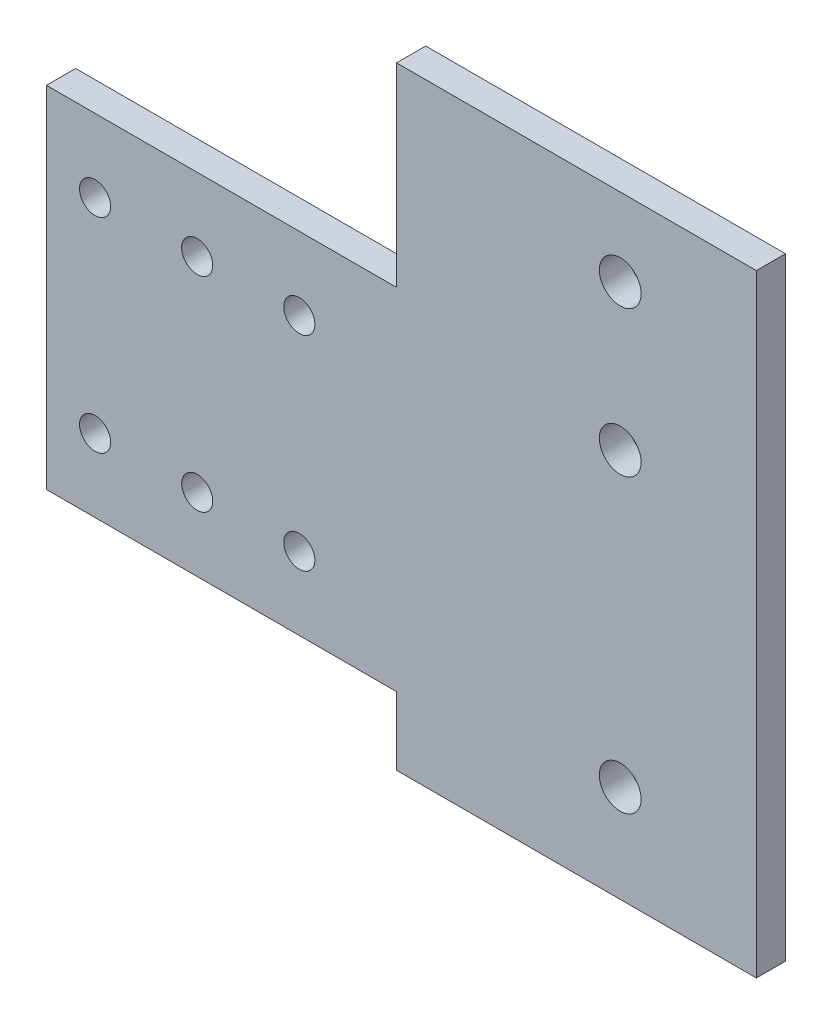
ISO-10303-21;
HEADER;
FILE_DESCRIPTION(('STEP AP214'),'2;1');
FILE_NAME('part.step','',(''),(''),'','','');
FILE_SCHEMA(('AUTOMOTIVE_DESIGN { 1 0 10303 214 1 1 1 1 }'));
ENDSEC;
DATA;
#1=APPLICATION_CONTEXT('core data for automotive mechanical design processes');
#2=APPLICATION_PROTOCOL_DEFINITION('international standard','automotive_design',2000,#1);
#3=PRODUCT_CONTEXT('',#1,'mechanical');
#4=PRODUCT('Part','Part','',(#3));
#5=PRODUCT_RELATED_PRODUCT_CATEGORY('part','',(#4));
#6=PRODUCT_DEFINITION_FORMATION('','',#4);
#7=PRODUCT_DEFINITION_CONTEXT('part definition',#1,'design');
#8=PRODUCT_DEFINITION('design','',#6,#7);
#9=PRODUCT_DEFINITION_SHAPE('','',#8);
#10=(LENGTH_UNIT() NAMED_UNIT(*) SI_UNIT(.MILLI.,.METRE.));
#11=(NAMED_UNIT(*) PLANE_ANGLE_UNIT() SI_UNIT($,.RADIAN.));
#12=(NAMED_UNIT(*) SI_UNIT($,.STERADIAN.) SOLID_ANGLE_UNIT());
#13=UNCERTAINTY_MEASURE_WITH_UNIT(LENGTH_MEASURE(1.E-05),#10,'distance_accuracy_value','');
#14=(GEOMETRIC_REPRESENTATION_CONTEXT(3) GLOBAL_UNCERTAINTY_ASSIGNED_CONTEXT((#13)) GLOBAL_UNIT_ASSIGNED_CONTEXT((#10,
#11,#12)) REPRESENTATION_CONTEXT('',''));
#15=CARTESIAN_POINT('',(0.,0.,0.));
#16=DIRECTION('',(0.,0.,1.));
#17=DIRECTION('',(1.,0.,0.));
#18=AXIS2_PLACEMENT_3D('',#15,#16,#17);
#19=CARTESIAN_POINT('',(0.,-36.,3.));
#20=DIRECTION('',(1.,0.,0.));
#21=DIRECTION('',(0.,0.,-1.));
#22=AXIS2_PLACEMENT_3D('',#19,#20,#21);
#23=PLANE('',#22);
#24=DIRECTION('',(0.,-1.,0.));
#25=VECTOR('',#24,1.);
#26=CARTESIAN_POINT('',(0.,-36.,0.));
#27=LINE('',#26,#25);
#28=CARTESIAN_POINT('',(0.,0.,0.));
#29=VERTEX_POINT('',#28);
#30=CARTESIAN_POINT('',(0.,-36.,0.));
#31=VERTEX_POINT('',#30);
#32=EDGE_CURVE('E131',#29,#31,#27,.T.);
#33=ORIENTED_EDGE('',*,*,#32,.T.);
#34=DIRECTION('',(0.,0.,-1.));
#35=VECTOR('',#34,1.);
#36=CARTESIAN_POINT('',(0.,-36.,3.));
#37=LINE('',#36,#35);
#38=CARTESIAN_POINT('',(0.,-36.,3.));
#39=VERTEX_POINT('',#38);
#40=EDGE_CURVE('E11',#39,#31,#37,.T.);
#41=ORIENTED_EDGE('',*,*,#40,.F.);
#42=DIRECTION('',(0.,-1.,0.));
#43=VECTOR('',#42,1.);
#44=CARTESIAN_POINT('',(0.,-36.,3.));
#45=LINE('',#44,#43);
#46=CARTESIAN_POINT('',(0.,0.,3.));
#47=VERTEX_POINT('',#46);
#48=EDGE_CURVE('E146',#47,#39,#45,.T.);
#49=ORIENTED_EDGE('',*,*,#48,.F.);
#50=DIRECTION('',(0.,0.,-1.));
#51=VECTOR('',#50,1.);
#52=CARTESIAN_POINT('',(0.,0.,3.));
#53=LINE('',#52,#51);
#54=EDGE_CURVE('E127',#47,#29,#53,.T.);
#55=ORIENTED_EDGE('',*,*,#54,.T.);
#56=EDGE_LOOP('',(#33,#41,#49,#55));
#57=FACE_BOUND('',#56,.T.);
#58=ADVANCED_FACE('F33',(#57),#23,.F.);
#59=CARTESIAN_POINT('',(36.,-36.,3.));
#60=DIRECTION('',(0.,1.,0.));
#61=DIRECTION('',(-1.,0.,0.));
#62=AXIS2_PLACEMENT_3D('',#59,#60,#61);
#63=PLANE('',#62);
#64=DIRECTION('',(1.,0.,0.));
#65=VECTOR('',#64,1.);
#66=CARTESIAN_POINT('',(36.,-36.,0.));
#67=LINE('',#66,#65);
#68=CARTESIAN_POINT('',(36.,-36.,0.));
#69=VERTEX_POINT('',#68);
#70=EDGE_CURVE('E134',#31,#69,#67,.T.);
#71=ORIENTED_EDGE('',*,*,#70,.T.);
#72=DIRECTION('',(0.,0.,-1.));
#73=VECTOR('',#72,1.);
#74=CARTESIAN_POINT('',(36.,-36.,3.));
#75=LINE('',#74,#73);
#76=CARTESIAN_POINT('',(36.,-36.,3.));
#77=VERTEX_POINT('',#76);
#78=EDGE_CURVE('E40',#77,#69,#75,.T.);
#79=ORIENTED_EDGE('',*,*,#78,.F.);
#80=DIRECTION('',(1.,0.,0.));
#81=VECTOR('',#80,1.);
#82=CARTESIAN_POINT('',(36.,-36.,3.));
#83=LINE('',#82,#81);
#84=EDGE_CURVE('E91',#39,#77,#83,.T.);
#85=ORIENTED_EDGE('',*,*,#84,.F.);
#86=ORIENTED_EDGE('',*,*,#40,.T.);
#87=EDGE_LOOP('',(#71,#79,#85,#86));
#88=FACE_BOUND('',#87,.T.);
#89=ADVANCED_FACE('F234',(#88),#63,.F.);
#90=CARTESIAN_POINT('',(36.,-56.,3.));
#91=DIRECTION('',(1.,0.,0.));
#92=DIRECTION('',(0.,1.,0.));
#93=AXIS2_PLACEMENT_3D('',#90,#91,#92);
#94=PLANE('',#93);
#95=DIRECTION('',(0.,-1.,0.));
#96=VECTOR('',#95,1.);
#97=CARTESIAN_POINT('',(36.,-56.,0.));
#98=LINE('',#97,#96);
#99=CARTESIAN_POINT('',(36.,-43.,0.));
#100=VERTEX_POINT('',#99);
#101=EDGE_CURVE('E137',#69,#100,#98,.T.);
#102=ORIENTED_EDGE('',*,*,#101,.T.);
#103=DIRECTION('',(0.,0.,1.));
#104=VECTOR('',#103,1.);
#105=CARTESIAN_POINT('',(36.,-43.,0.));
#106=LINE('',#105,#104);
#107=CARTESIAN_POINT('',(36.,-43.,3.));
#108=VERTEX_POINT('',#107);
#109=EDGE_CURVE('E47',#100,#108,#106,.T.);
#110=ORIENTED_EDGE('',*,*,#109,.T.);
#111=DIRECTION('',(0.,-1.,0.));
#112=VECTOR('',#111,1.);
#113=CARTESIAN_POINT('',(36.,-56.,3.));
#114=LINE('',#113,#112);
#115=EDGE_CURVE('E154',#77,#108,#114,.T.);
#116=ORIENTED_EDGE('',*,*,#115,.F.);
#117=ORIENTED_EDGE('',*,*,#78,.T.);
#118=EDGE_LOOP('',(#102,#110,#116,#117));
#119=FACE_BOUND('',#118,.T.);
#120=ADVANCED_FACE('F153',(#119),#94,.F.);
#121=CARTESIAN_POINT('',(73.,20.,3.));
#122=DIRECTION('',(-1.,0.,0.));
#123=DIRECTION('',(0.,0.,1.));
#124=AXIS2_PLACEMENT_3D('',#121,#122,#123);
#125=PLANE('',#124);
#126=DIRECTION('',(0.,1.,0.));
#127=VECTOR('',#126,1.);
#128=CARTESIAN_POINT('',(73.,20.,3.));
#129=LINE('',#128,#127);
#130=CARTESIAN_POINT('',(73.,-43.,3.));
#131=VERTEX_POINT('',#130);
#132=CARTESIAN_POINT('',(73.,20.,3.));
#133=VERTEX_POINT('',#132);
#134=EDGE_CURVE('E110',#131,#133,#129,.T.);
#135=ORIENTED_EDGE('',*,*,#134,.F.);
#136=DIRECTION('',(0.,0.,1.));
#137=VECTOR('',#136,1.);
#138=CARTESIAN_POINT('',(73.,-43.,0.));
#139=LINE('',#138,#137);
#140=CARTESIAN_POINT('',(73.,-43.,0.));
#141=VERTEX_POINT('',#140);
#142=EDGE_CURVE('E163',#141,#131,#139,.T.);
#143=ORIENTED_EDGE('',*,*,#142,.F.);
#144=DIRECTION('',(0.,1.,0.));
#145=VECTOR('',#144,1.);
#146=CARTESIAN_POINT('',(73.,20.,0.));
#147=LINE('',#146,#145);
#148=CARTESIAN_POINT('',(73.,20.,0.));
#149=VERTEX_POINT('',#148);
#150=EDGE_CURVE('E140',#141,#149,#147,.T.);
#151=ORIENTED_EDGE('',*,*,#150,.T.);
#152=DIRECTION('',(0.,0.,-1.));
#153=VECTOR('',#152,1.);
#154=CARTESIAN_POINT('',(73.,20.,3.));
#155=LINE('',#154,#153);
#156=EDGE_CURVE('E122',#133,#149,#155,.T.);
#157=ORIENTED_EDGE('',*,*,#156,.F.);
#158=EDGE_LOOP('',(#135,#143,#151,#157));
#159=FACE_BOUND('',#158,.T.);
#160=ADVANCED_FACE('F229',(#159),#125,.F.);
#161=CARTESIAN_POINT('',(36.,20.,3.));
#162=DIRECTION('',(0.,-1.,0.));
#163=DIRECTION('',(0.,0.,-1.));
#164=AXIS2_PLACEMENT_3D('',#161,#162,#163);
#165=PLANE('',#164);
#166=DIRECTION('',(-1.,0.,0.));
#167=VECTOR('',#166,1.);
#168=CARTESIAN_POINT('',(36.,20.,0.));
#169=LINE('',#168,#167);
#170=CARTESIAN_POINT('',(36.,20.,0.));
#171=VERTEX_POINT('',#170);
#172=EDGE_CURVE('E119',#149,#171,#169,.T.);
#173=ORIENTED_EDGE('',*,*,#172,.T.);
#174=DIRECTION('',(0.,0.,-1.));
#175=VECTOR('',#174,1.);
#176=CARTESIAN_POINT('',(36.,20.,3.));
#177=LINE('',#176,#175);
#178=CARTESIAN_POINT('',(36.,20.,3.));
#179=VERTEX_POINT('',#178);
#180=EDGE_CURVE('E116',#179,#171,#177,.T.);
#181=ORIENTED_EDGE('',*,*,#180,.F.);
#182=DIRECTION('',(-1.,0.,0.));
#183=VECTOR('',#182,1.);
#184=CARTESIAN_POINT('',(36.,20.,3.));
#185=LINE('',#184,#183);
#186=EDGE_CURVE('E101',#133,#179,#185,.T.);
#187=ORIENTED_EDGE('',*,*,#186,.F.);
#188=ORIENTED_EDGE('',*,*,#156,.T.);
#189=EDGE_LOOP('',(#173,#181,#187,#188));
#190=FACE_BOUND('',#189,.T.);
#191=ADVANCED_FACE('F117',(#190),#165,.F.);
#192=CARTESIAN_POINT('',(36.,0.,3.));
#193=DIRECTION('',(1.,0.,0.));
#194=DIRECTION('',(0.,0.,-1.));
#195=AXIS2_PLACEMENT_3D('',#192,#193,#194);
#196=PLANE('',#195);
#197=DIRECTION('',(0.,-1.,0.));
#198=VECTOR('',#197,1.);
#199=CARTESIAN_POINT('',(36.,0.,0.));
#200=LINE('',#199,#198);
#201=CARTESIAN_POINT('',(36.,0.,0.));
#202=VERTEX_POINT('',#201);
#203=EDGE_CURVE('E143',#171,#202,#200,.T.);
#204=ORIENTED_EDGE('',*,*,#203,.T.);
#205=DIRECTION('',(0.,0.,-1.));
#206=VECTOR('',#205,1.);
#207=CARTESIAN_POINT('',(36.,0.,3.));
#208=LINE('',#207,#206);
#209=CARTESIAN_POINT('',(36.,0.,3.));
#210=VERTEX_POINT('',#209);
#211=EDGE_CURVE('E123',#210,#202,#208,.T.);
#212=ORIENTED_EDGE('',*,*,#211,.F.);
#213=DIRECTION('',(0.,-1.,0.));
#214=VECTOR('',#213,1.);
#215=CARTESIAN_POINT('',(36.,0.,3.));
#216=LINE('',#215,#214);
#217=EDGE_CURVE('E106',#179,#210,#216,.T.);
#218=ORIENTED_EDGE('',*,*,#217,.F.);
#219=ORIENTED_EDGE('',*,*,#180,.T.);
#220=EDGE_LOOP('',(#204,#212,#218,#219));
#221=FACE_BOUND('',#220,.T.);
#222=ADVANCED_FACE('F125',(#221),#196,.F.);
#223=CARTESIAN_POINT('',(0.,0.,3.));
#224=DIRECTION('',(0.,-1.,0.));
#225=DIRECTION('',(0.,0.,-1.));
#226=AXIS2_PLACEMENT_3D('',#223,#224,#225);
#227=PLANE('',#226);
#228=DIRECTION('',(-1.,0.,0.));
#229=VECTOR('',#228,1.);
#230=CARTESIAN_POINT('',(0.,0.,0.));
#231=LINE('',#230,#229);
#232=EDGE_CURVE('E83',#202,#29,#231,.T.);
#233=ORIENTED_EDGE('',*,*,#232,.T.);
#234=ORIENTED_EDGE('',*,*,#54,.F.);
#235=DIRECTION('',(-1.,0.,0.));
#236=VECTOR('',#235,1.);
#237=CARTESIAN_POINT('',(0.,0.,3.));
#238=LINE('',#237,#236);
#239=EDGE_CURVE('E56',#210,#47,#238,.T.);
#240=ORIENTED_EDGE('',*,*,#239,.F.);
#241=ORIENTED_EDGE('',*,*,#211,.T.);
#242=EDGE_LOOP('',(#233,#234,#240,#241));
#243=FACE_BOUND('',#242,.T.);
#244=ADVANCED_FACE('F230',(#243),#227,.F.);
#245=CARTESIAN_POINT('',(0.,0.,3.));
#246=DIRECTION('',(0.,0.,-1.));
#247=DIRECTION('',(-1.,0.,0.));
#248=AXIS2_PLACEMENT_3D('',#245,#246,#247);
#249=PLANE('',#248);
#250=CARTESIAN_POINT('',(58.9999999999934,11.9999999999997,3.));
#251=DIRECTION('',(0.,0.,-1.));
#252=DIRECTION('',(-1.,0.,0.));
#253=AXIS2_PLACEMENT_3D('',#250,#251,#252);
#254=CIRCLE('',#253,2.15);
#255=CARTESIAN_POINT('',(56.8499999999934,11.9999999999997,3.));
#256=VERTEX_POINT('',#255);
#257=EDGE_CURVE('E171',#256,#256,#254,.T.);
#258=ORIENTED_EDGE('',*,*,#257,.T.);
#259=EDGE_LOOP('',(#258));
#260=FACE_BOUND('',#259,.T.);
#261=CARTESIAN_POINT('',(58.9999999999934,-3.00000000000027,3.));
#262=DIRECTION('',(0.,0.,-1.));
#263=DIRECTION('',(-1.,0.,0.));
#264=AXIS2_PLACEMENT_3D('',#261,#262,#263);
#265=CIRCLE('',#264,2.15);
#266=CARTESIAN_POINT('',(56.8499999999934,-3.00000000000027,3.));
#267=VERTEX_POINT('',#266);
#268=EDGE_CURVE('E178',#267,#267,#265,.T.);
#269=ORIENTED_EDGE('',*,*,#268,.T.);
#270=EDGE_LOOP('',(#269));
#271=FACE_BOUND('',#270,.T.);
#272=CARTESIAN_POINT('',(58.9999999999999,-33.0000000000002,3.));
#273=DIRECTION('',(0.,0.,-1.));
#274=DIRECTION('',(-1.,0.,0.));
#275=AXIS2_PLACEMENT_3D('',#272,#273,#274);
#276=CIRCLE('',#275,2.15);
#277=CARTESIAN_POINT('',(56.8499999999999,-33.0000000000002,3.));
#278=VERTEX_POINT('',#277);
#279=EDGE_CURVE('E183',#278,#278,#276,.T.);
#280=ORIENTED_EDGE('',*,*,#279,.T.);
#281=EDGE_LOOP('',(#280));
#282=FACE_BOUND('',#281,.T.);
#283=CARTESIAN_POINT('',(15.5,-28.5,3.));
#284=DIRECTION('',(0.,0.,-1.));
#285=DIRECTION('',(-1.,0.,0.));
#286=AXIS2_PLACEMENT_3D('',#283,#284,#285);
#287=CIRCLE('',#286,1.6);
#288=CARTESIAN_POINT('',(13.9,-28.5,3.));
#289=VERTEX_POINT('',#288);
#290=EDGE_CURVE('E202',#289,#289,#287,.T.);
#291=ORIENTED_EDGE('',*,*,#290,.T.);
#292=EDGE_LOOP('',(#291));
#293=FACE_BOUND('',#292,.T.);
#294=CARTESIAN_POINT('',(5.,-28.5,3.));
#295=DIRECTION('',(0.,0.,-1.));
#296=DIRECTION('',(-1.,0.,0.));
#297=AXIS2_PLACEMENT_3D('',#294,#295,#296);
#298=CIRCLE('',#297,1.6);
#299=CARTESIAN_POINT('',(3.4,-28.5,3.));
#300=VERTEX_POINT('',#299);
#301=EDGE_CURVE('E195',#300,#300,#298,.T.);
#302=ORIENTED_EDGE('',*,*,#301,.T.);
#303=EDGE_LOOP('',(#302));
#304=FACE_BOUND('',#303,.T.);
#305=CARTESIAN_POINT('',(5.,-7.5,3.));
#306=DIRECTION('',(0.,0.,-1.));
#307=DIRECTION('',(-1.,0.,0.));
#308=AXIS2_PLACEMENT_3D('',#305,#306,#307);
#309=CIRCLE('',#308,1.6);
#310=CARTESIAN_POINT('',(3.4,-7.5,3.));
#311=VERTEX_POINT('',#310);
#312=EDGE_CURVE('E214',#311,#311,#309,.T.);
#313=ORIENTED_EDGE('',*,*,#312,.T.);
#314=EDGE_LOOP('',(#313));
#315=FACE_BOUND('',#314,.T.);
#316=CARTESIAN_POINT('',(26.,-28.5,3.));
#317=DIRECTION('',(0.,0.,-1.));
#318=DIRECTION('',(-1.,0.,0.));
#319=AXIS2_PLACEMENT_3D('',#316,#317,#318);
#320=CIRCLE('',#319,1.6);
#321=CARTESIAN_POINT('',(24.4,-28.5,3.));
#322=VERTEX_POINT('',#321);
#323=EDGE_CURVE('E207',#322,#322,#320,.T.);
#324=ORIENTED_EDGE('',*,*,#323,.T.);
#325=EDGE_LOOP('',(#324));
#326=FACE_BOUND('',#325,.T.);
#327=CARTESIAN_POINT('',(15.5,-7.5,3.));
#328=DIRECTION('',(0.,0.,-1.));
#329=DIRECTION('',(-1.,0.,0.));
#330=AXIS2_PLACEMENT_3D('',#327,#328,#329);
#331=CIRCLE('',#330,1.6);
#332=CARTESIAN_POINT('',(13.9,-7.5,3.));
#333=VERTEX_POINT('',#332);
#334=EDGE_CURVE('E189',#333,#333,#331,.T.);
#335=ORIENTED_EDGE('',*,*,#334,.T.);
#336=EDGE_LOOP('',(#335));
#337=FACE_BOUND('',#336,.T.);
#338=CARTESIAN_POINT('',(26.,-7.5,3.));
#339=DIRECTION('',(0.,0.,-1.));
#340=DIRECTION('',(-1.,0.,0.));
#341=AXIS2_PLACEMENT_3D('',#338,#339,#340);
#342=CIRCLE('',#341,1.6);
#343=CARTESIAN_POINT('',(24.4,-7.5,3.));
#344=VERTEX_POINT('',#343);
#345=EDGE_CURVE('E135',#344,#344,#342,.T.);
#346=ORIENTED_EDGE('',*,*,#345,.T.);
#347=EDGE_LOOP('',(#346));
#348=FACE_BOUND('',#347,.T.);
#349=ORIENTED_EDGE('',*,*,#115,.T.);
#350=DIRECTION('',(-1.,0.,0.));
#351=VECTOR('',#350,1.);
#352=CARTESIAN_POINT('',(36.,-43.,3.));
#353=LINE('',#352,#351);
#354=EDGE_CURVE('E164',#131,#108,#353,.T.);
#355=ORIENTED_EDGE('',*,*,#354,.F.);
#356=ORIENTED_EDGE('',*,*,#134,.T.);
#357=ORIENTED_EDGE('',*,*,#186,.T.);
#358=ORIENTED_EDGE('',*,*,#217,.T.);
#359=ORIENTED_EDGE('',*,*,#239,.T.);
#360=ORIENTED_EDGE('',*,*,#48,.T.);
#361=ORIENTED_EDGE('',*,*,#84,.T.);
#362=EDGE_LOOP('',(#349,#355,#356,#357,#358,#359,#360,#361));
#363=FACE_BOUND('',#362,.T.);
#364=ADVANCED_FACE('F104',(#260,#271,#282,#293,#304,#315,#326,#337,#348,#363),#249,.F.);
#365=CARTESIAN_POINT('',(0.,0.,0.));
#366=DIRECTION('',(0.,0.,-1.));
#367=DIRECTION('',(-1.,0.,0.));
#368=AXIS2_PLACEMENT_3D('',#365,#366,#367);
#369=PLANE('',#368);
#370=DIRECTION('',(-1.,0.,0.));
#371=VECTOR('',#370,1.);
#372=CARTESIAN_POINT('',(36.,-43.,0.));
#373=LINE('',#372,#371);
#374=EDGE_CURVE('E160',#141,#100,#373,.T.);
#375=ORIENTED_EDGE('',*,*,#374,.T.);
#376=ORIENTED_EDGE('',*,*,#101,.F.);
#377=ORIENTED_EDGE('',*,*,#70,.F.);
#378=ORIENTED_EDGE('',*,*,#32,.F.);
#379=ORIENTED_EDGE('',*,*,#232,.F.);
#380=ORIENTED_EDGE('',*,*,#203,.F.);
#381=ORIENTED_EDGE('',*,*,#172,.F.);
#382=ORIENTED_EDGE('',*,*,#150,.F.);
#383=EDGE_LOOP('',(#375,#376,#377,#378,#379,#380,#381,#382));
#384=FACE_BOUND('',#383,.T.);
#385=CARTESIAN_POINT('',(58.9999999999934,11.9999999999997,0.));
#386=DIRECTION('',(0.,0.,-1.));
#387=DIRECTION('',(-1.,0.,0.));
#388=AXIS2_PLACEMENT_3D('',#385,#386,#387);
#389=CIRCLE('',#388,2.15);
#390=CARTESIAN_POINT('',(56.8499999999934,11.9999999999997,0.));
#391=VERTEX_POINT('',#390);
#392=EDGE_CURVE('E175',#391,#391,#389,.T.);
#393=ORIENTED_EDGE('',*,*,#392,.F.);
#394=EDGE_LOOP('',(#393));
#395=FACE_BOUND('',#394,.T.);
#396=CARTESIAN_POINT('',(58.9999999999934,-3.00000000000027,0.));
#397=DIRECTION('',(0.,0.,-1.));
#398=DIRECTION('',(-1.,0.,0.));
#399=AXIS2_PLACEMENT_3D('',#396,#397,#398);
#400=CIRCLE('',#399,2.15);
#401=CARTESIAN_POINT('',(56.8499999999934,-3.00000000000027,0.));
#402=VERTEX_POINT('',#401);
#403=EDGE_CURVE('E169',#402,#402,#400,.T.);
#404=ORIENTED_EDGE('',*,*,#403,.F.);
#405=EDGE_LOOP('',(#404));
#406=FACE_BOUND('',#405,.T.);
#407=CARTESIAN_POINT('',(58.9999999999999,-33.0000000000002,0.));
#408=DIRECTION('',(0.,0.,-1.));
#409=DIRECTION('',(-1.,0.,0.));
#410=AXIS2_PLACEMENT_3D('',#407,#408,#409);
#411=CIRCLE('',#410,2.15);
#412=CARTESIAN_POINT('',(56.8499999999999,-33.0000000000002,0.));
#413=VERTEX_POINT('',#412);
#414=EDGE_CURVE('E174',#413,#413,#411,.T.);
#415=ORIENTED_EDGE('',*,*,#414,.F.);
#416=EDGE_LOOP('',(#415));
#417=FACE_BOUND('',#416,.T.);
#418=CARTESIAN_POINT('',(15.5,-28.5,0.));
#419=DIRECTION('',(0.,0.,-1.));
#420=DIRECTION('',(-1.,0.,0.));
#421=AXIS2_PLACEMENT_3D('',#418,#419,#420);
#422=CIRCLE('',#421,1.6);
#423=CARTESIAN_POINT('',(13.9,-28.5,0.));
#424=VERTEX_POINT('',#423);
#425=EDGE_CURVE('E192',#424,#424,#422,.T.);
#426=ORIENTED_EDGE('',*,*,#425,.F.);
#427=EDGE_LOOP('',(#426));
#428=FACE_BOUND('',#427,.T.);
#429=CARTESIAN_POINT('',(5.,-28.5,0.));
#430=DIRECTION('',(0.,0.,-1.));
#431=DIRECTION('',(-1.,0.,0.));
#432=AXIS2_PLACEMENT_3D('',#429,#430,#431);
#433=CIRCLE('',#432,1.6);
#434=CARTESIAN_POINT('',(3.4,-28.5,0.));
#435=VERTEX_POINT('',#434);
#436=EDGE_CURVE('E199',#435,#435,#433,.T.);
#437=ORIENTED_EDGE('',*,*,#436,.F.);
#438=EDGE_LOOP('',(#437));
#439=FACE_BOUND('',#438,.T.);
#440=CARTESIAN_POINT('',(5.,-7.5,0.));
#441=DIRECTION('',(0.,0.,-1.));
#442=DIRECTION('',(-1.,0.,0.));
#443=AXIS2_PLACEMENT_3D('',#440,#441,#442);
#444=CIRCLE('',#443,1.6);
#445=CARTESIAN_POINT('',(3.4,-7.5,0.));
#446=VERTEX_POINT('',#445);
#447=EDGE_CURVE('E198',#446,#446,#444,.T.);
#448=ORIENTED_EDGE('',*,*,#447,.F.);
#449=EDGE_LOOP('',(#448));
#450=FACE_BOUND('',#449,.T.);
#451=CARTESIAN_POINT('',(26.,-28.5,0.));
#452=DIRECTION('',(0.,0.,-1.));
#453=DIRECTION('',(-1.,0.,0.));
#454=AXIS2_PLACEMENT_3D('',#451,#452,#453);
#455=CIRCLE('',#454,1.6);
#456=CARTESIAN_POINT('',(24.4,-28.5,0.));
#457=VERTEX_POINT('',#456);
#458=EDGE_CURVE('E211',#457,#457,#455,.T.);
#459=ORIENTED_EDGE('',*,*,#458,.F.);
#460=EDGE_LOOP('',(#459));
#461=FACE_BOUND('',#460,.T.);
#462=CARTESIAN_POINT('',(15.5,-7.5,0.));
#463=DIRECTION('',(0.,0.,-1.));
#464=DIRECTION('',(-1.,0.,0.));
#465=AXIS2_PLACEMENT_3D('',#462,#463,#464);
#466=CIRCLE('',#465,1.6);
#467=CARTESIAN_POINT('',(13.9,-7.5,0.));
#468=VERTEX_POINT('',#467);
#469=EDGE_CURVE('E186',#468,#468,#466,.T.);
#470=ORIENTED_EDGE('',*,*,#469,.F.);
#471=EDGE_LOOP('',(#470));
#472=FACE_BOUND('',#471,.T.);
#473=CARTESIAN_POINT('',(26.,-7.5,0.));
#474=DIRECTION('',(0.,0.,-1.));
#475=DIRECTION('',(-1.,0.,0.));
#476=AXIS2_PLACEMENT_3D('',#473,#474,#475);
#477=CIRCLE('',#476,1.6);
#478=CARTESIAN_POINT('',(24.4,-7.5,0.));
#479=VERTEX_POINT('',#478);
#480=EDGE_CURVE('E210',#479,#479,#477,.T.);
#481=ORIENTED_EDGE('',*,*,#480,.F.);
#482=EDGE_LOOP('',(#481));
#483=FACE_BOUND('',#482,.T.);
#484=ADVANCED_FACE('F156',(#384,#395,#406,#417,#428,#439,#450,#461,#472,#483),#369,.T.);
#485=CARTESIAN_POINT('',(26.,-7.5,3.));
#486=DIRECTION('',(0.,0.,-1.));
#487=DIRECTION('',(-1.,0.,0.));
#488=AXIS2_PLACEMENT_3D('',#485,#486,#487);
#489=CYLINDRICAL_SURFACE('',#488,1.6);
#490=ORIENTED_EDGE('',*,*,#345,.F.);
#491=EDGE_LOOP('',(#490));
#492=FACE_BOUND('',#491,.T.);
#493=ORIENTED_EDGE('',*,*,#480,.T.);
#494=EDGE_LOOP('',(#493));
#495=FACE_BOUND('',#494,.T.);
#496=ADVANCED_FACE('F252',(#492,#495),#489,.F.);
#497=CARTESIAN_POINT('',(15.5,-7.5,3.));
#498=DIRECTION('',(0.,0.,-1.));
#499=DIRECTION('',(-1.,0.,0.));
#500=AXIS2_PLACEMENT_3D('',#497,#498,#499);
#501=CYLINDRICAL_SURFACE('',#500,1.6);
#502=ORIENTED_EDGE('',*,*,#334,.F.);
#503=EDGE_LOOP('',(#502));
#504=FACE_BOUND('',#503,.T.);
#505=ORIENTED_EDGE('',*,*,#469,.T.);
#506=EDGE_LOOP('',(#505));
#507=FACE_BOUND('',#506,.T.);
#508=ADVANCED_FACE('F258',(#504,#507),#501,.F.);
#509=CARTESIAN_POINT('',(26.,-28.5,3.));
#510=DIRECTION('',(0.,0.,-1.));
#511=DIRECTION('',(-1.,0.,0.));
#512=AXIS2_PLACEMENT_3D('',#509,#510,#511);
#513=CYLINDRICAL_SURFACE('',#512,1.6);
#514=ORIENTED_EDGE('',*,*,#323,.F.);
#515=EDGE_LOOP('',(#514));
#516=FACE_BOUND('',#515,.T.);
#517=ORIENTED_EDGE('',*,*,#458,.T.);
#518=EDGE_LOOP('',(#517));
#519=FACE_BOUND('',#518,.T.);
#520=ADVANCED_FACE('F264',(#516,#519),#513,.F.);
#521=CARTESIAN_POINT('',(5.,-7.5,3.));
#522=DIRECTION('',(0.,0.,-1.));
#523=DIRECTION('',(-1.,0.,0.));
#524=AXIS2_PLACEMENT_3D('',#521,#522,#523);
#525=CYLINDRICAL_SURFACE('',#524,1.6);
#526=ORIENTED_EDGE('',*,*,#312,.F.);
#527=EDGE_LOOP('',(#526));
#528=FACE_BOUND('',#527,.T.);
#529=ORIENTED_EDGE('',*,*,#447,.T.);
#530=EDGE_LOOP('',(#529));
#531=FACE_BOUND('',#530,.T.);
#532=ADVANCED_FACE('F260',(#528,#531),#525,.F.);
#533=CARTESIAN_POINT('',(5.,-28.5,3.));
#534=DIRECTION('',(0.,0.,-1.));
#535=DIRECTION('',(-1.,0.,0.));
#536=AXIS2_PLACEMENT_3D('',#533,#534,#535);
#537=CYLINDRICAL_SURFACE('',#536,1.6);
#538=ORIENTED_EDGE('',*,*,#301,.F.);
#539=EDGE_LOOP('',(#538));
#540=FACE_BOUND('',#539,.T.);
#541=ORIENTED_EDGE('',*,*,#436,.T.);
#542=EDGE_LOOP('',(#541));
#543=FACE_BOUND('',#542,.T.);
#544=ADVANCED_FACE('F263',(#540,#543),#537,.F.);
#545=CARTESIAN_POINT('',(15.5,-28.5,3.));
#546=DIRECTION('',(0.,0.,-1.));
#547=DIRECTION('',(-1.,0.,0.));
#548=AXIS2_PLACEMENT_3D('',#545,#546,#547);
#549=CYLINDRICAL_SURFACE('',#548,1.6);
#550=ORIENTED_EDGE('',*,*,#290,.F.);
#551=EDGE_LOOP('',(#550));
#552=FACE_BOUND('',#551,.T.);
#553=ORIENTED_EDGE('',*,*,#425,.T.);
#554=EDGE_LOOP('',(#553));
#555=FACE_BOUND('',#554,.T.);
#556=ADVANCED_FACE('F269',(#552,#555),#549,.F.);
#557=CARTESIAN_POINT('',(58.9999999999999,-33.0000000000002,3.));
#558=DIRECTION('',(0.,0.,-1.));
#559=DIRECTION('',(-1.,0.,0.));
#560=AXIS2_PLACEMENT_3D('',#557,#558,#559);
#561=CYLINDRICAL_SURFACE('',#560,2.15);
#562=ORIENTED_EDGE('',*,*,#279,.F.);
#563=EDGE_LOOP('',(#562));
#564=FACE_BOUND('',#563,.T.);
#565=ORIENTED_EDGE('',*,*,#414,.T.);
#566=EDGE_LOOP('',(#565));
#567=FACE_BOUND('',#566,.T.);
#568=ADVANCED_FACE('F272',(#564,#567),#561,.F.);
#569=CARTESIAN_POINT('',(58.9999999999934,-3.00000000000027,3.));
#570=DIRECTION('',(0.,0.,-1.));
#571=DIRECTION('',(-1.,0.,0.));
#572=AXIS2_PLACEMENT_3D('',#569,#570,#571);
#573=CYLINDRICAL_SURFACE('',#572,2.15);
#574=ORIENTED_EDGE('',*,*,#268,.F.);
#575=EDGE_LOOP('',(#574));
#576=FACE_BOUND('',#575,.T.);
#577=ORIENTED_EDGE('',*,*,#403,.T.);
#578=EDGE_LOOP('',(#577));
#579=FACE_BOUND('',#578,.T.);
#580=ADVANCED_FACE('F282',(#576,#579),#573,.F.);
#581=CARTESIAN_POINT('',(58.9999999999934,11.9999999999997,3.));
#582=DIRECTION('',(0.,0.,-1.));
#583=DIRECTION('',(-1.,0.,0.));
#584=AXIS2_PLACEMENT_3D('',#581,#582,#583);
#585=CYLINDRICAL_SURFACE('',#584,2.15);
#586=ORIENTED_EDGE('',*,*,#257,.F.);
#587=EDGE_LOOP('',(#586));
#588=FACE_BOUND('',#587,.T.);
#589=ORIENTED_EDGE('',*,*,#392,.T.);
#590=EDGE_LOOP('',(#589));
#591=FACE_BOUND('',#590,.T.);
#592=ADVANCED_FACE('F286',(#588,#591),#585,.F.);
#593=CARTESIAN_POINT('',(36.,-43.,0.));
#594=DIRECTION('',(0.,1.,0.));
#595=DIRECTION('',(0.,0.,1.));
#596=AXIS2_PLACEMENT_3D('',#593,#594,#595);
#597=PLANE('',#596);
#598=ORIENTED_EDGE('',*,*,#354,.T.);
#599=ORIENTED_EDGE('',*,*,#109,.F.);
#600=ORIENTED_EDGE('',*,*,#374,.F.);
#601=ORIENTED_EDGE('',*,*,#142,.T.);
#602=EDGE_LOOP('',(#598,#599,#600,#601));
#603=FACE_BOUND('',#602,.T.);
#604=ADVANCED_FACE('F227',(#603),#597,.F.);
#605=CLOSED_SHELL('',(#58,#89,#120,#160,#191,#222,#244,#364,#484,#496,#508,#520,#532,#544,#556,
#568,#580,#592,#604));
#606=MANIFOLD_SOLID_BREP('B2',#605);
#607=ADVANCED_BREP_SHAPE_REPRESENTATION('',(#18,#606),#14);
#608=SHAPE_DEFINITION_REPRESENTATION(#9,#607);
ENDSEC;
END-ISO-10303-21;
